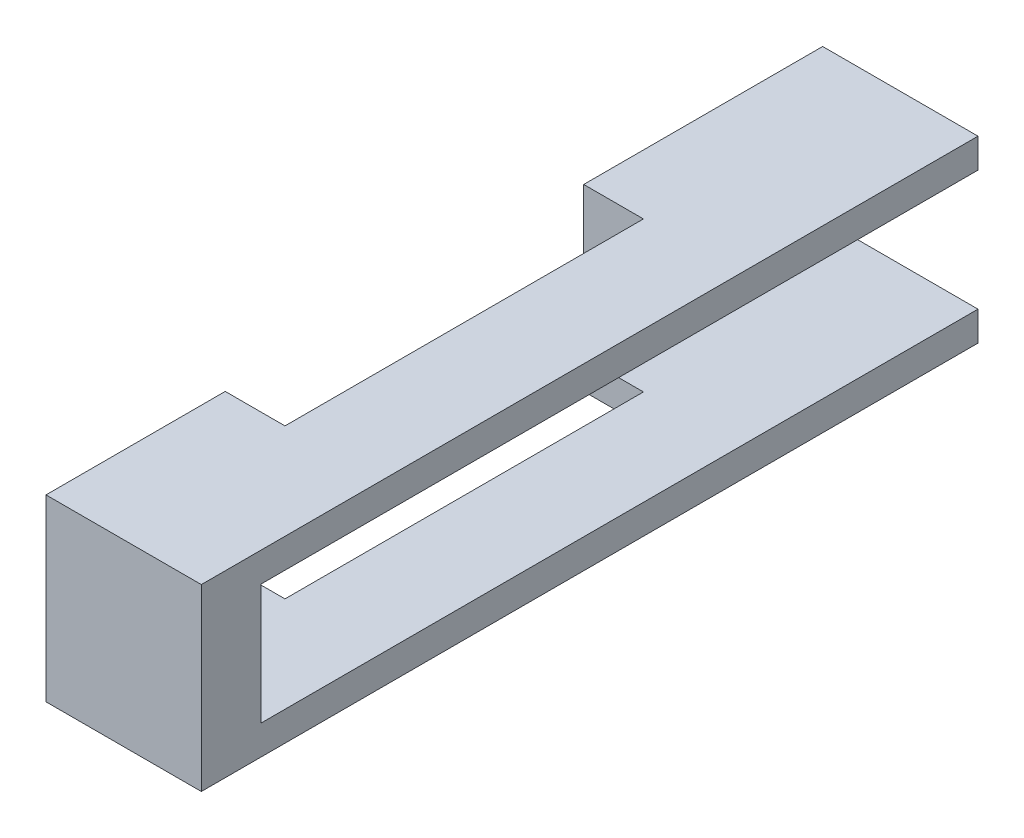
ISO-10303-21;
HEADER;
FILE_DESCRIPTION(('STEP AP214'),'2;1');
FILE_NAME('part.step','',(''),(''),'','','');
FILE_SCHEMA(('AUTOMOTIVE_DESIGN { 1 0 10303 214 1 1 1 1 }'));
ENDSEC;
DATA;
#1=APPLICATION_CONTEXT('core data for automotive mechanical design processes');
#2=APPLICATION_PROTOCOL_DEFINITION('international standard','automotive_design',2000,#1);
#3=PRODUCT_CONTEXT('',#1,'mechanical');
#4=PRODUCT('Part','Part','',(#3));
#5=PRODUCT_RELATED_PRODUCT_CATEGORY('part','',(#4));
#6=PRODUCT_DEFINITION_FORMATION('','',#4);
#7=PRODUCT_DEFINITION_CONTEXT('part definition',#1,'design');
#8=PRODUCT_DEFINITION('design','',#6,#7);
#9=PRODUCT_DEFINITION_SHAPE('','',#8);
#10=(LENGTH_UNIT() NAMED_UNIT(*) SI_UNIT(.MILLI.,.METRE.));
#11=(NAMED_UNIT(*) PLANE_ANGLE_UNIT() SI_UNIT($,.RADIAN.));
#12=(NAMED_UNIT(*) SI_UNIT($,.STERADIAN.) SOLID_ANGLE_UNIT());
#13=UNCERTAINTY_MEASURE_WITH_UNIT(LENGTH_MEASURE(1.E-05),#10,'distance_accuracy_value','');
#14=(GEOMETRIC_REPRESENTATION_CONTEXT(3) GLOBAL_UNCERTAINTY_ASSIGNED_CONTEXT((#13)) GLOBAL_UNIT_ASSIGNED_CONTEXT((#10,
#11,#12)) REPRESENTATION_CONTEXT('',''));
#15=CARTESIAN_POINT('',(0.,0.,0.));
#16=DIRECTION('',(0.,0.,1.));
#17=DIRECTION('',(1.,0.,0.));
#18=AXIS2_PLACEMENT_3D('',#15,#16,#17);
#19=CARTESIAN_POINT('',(0.,30.,0.));
#20=DIRECTION('',(0.,1.,0.));
#21=DIRECTION('',(0.,0.,1.));
#22=AXIS2_PLACEMENT_3D('',#19,#20,#21);
#23=PLANE('',#22);
#24=DIRECTION('',(0.,0.,1.));
#25=VECTOR('',#24,1.);
#26=CARTESIAN_POINT('',(16.,30.,-135.));
#27=LINE('',#26,#25);
#28=CARTESIAN_POINT('',(16.,30.,-115.));
#29=VERTEX_POINT('',#28);
#30=CARTESIAN_POINT('',(16.,30.,15.));
#31=VERTEX_POINT('',#30);
#32=EDGE_CURVE('E240',#29,#31,#27,.T.);
#33=ORIENTED_EDGE('',*,*,#32,.F.);
#34=DIRECTION('',(-1.,0.,0.));
#35=VECTOR('',#34,1.);
#36=CARTESIAN_POINT('',(0.,30.,-115.));
#37=LINE('',#36,#35);
#38=CARTESIAN_POINT('',(-10.,30.,-115.));
#39=VERTEX_POINT('',#38);
#40=EDGE_CURVE('E53',#29,#39,#37,.T.);
#41=ORIENTED_EDGE('',*,*,#40,.T.);
#42=DIRECTION('',(0.,0.,-1.));
#43=VECTOR('',#42,1.);
#44=CARTESIAN_POINT('',(-10.,30.,-75.));
#45=LINE('',#44,#43);
#46=CARTESIAN_POINT('',(-10.,30.,-75.));
#47=VERTEX_POINT('',#46);
#48=EDGE_CURVE('E165',#47,#39,#45,.T.);
#49=ORIENTED_EDGE('',*,*,#48,.F.);
#50=DIRECTION('',(-1.,0.,0.));
#51=VECTOR('',#50,1.);
#52=CARTESIAN_POINT('',(0.,30.,-75.));
#53=LINE('',#52,#51);
#54=CARTESIAN_POINT('',(0.,30.,-75.));
#55=VERTEX_POINT('',#54);
#56=EDGE_CURVE('E280',#55,#47,#53,.T.);
#57=ORIENTED_EDGE('',*,*,#56,.F.);
#58=DIRECTION('',(0.,0.,1.));
#59=VECTOR('',#58,1.);
#60=CARTESIAN_POINT('',(0.,30.,-135.));
#61=LINE('',#60,#59);
#62=CARTESIAN_POINT('',(0.,30.,-15.));
#63=VERTEX_POINT('',#62);
#64=EDGE_CURVE('E188',#55,#63,#61,.T.);
#65=ORIENTED_EDGE('',*,*,#64,.T.);
#66=DIRECTION('',(-1.,0.,0.));
#67=VECTOR('',#66,1.);
#68=CARTESIAN_POINT('',(-15.,30.,-15.));
#69=LINE('',#68,#67);
#70=CARTESIAN_POINT('',(-9.99999999999998,30.,-15.));
#71=VERTEX_POINT('',#70);
#72=EDGE_CURVE('E202',#63,#71,#69,.T.);
#73=ORIENTED_EDGE('',*,*,#72,.T.);
#74=DIRECTION('',(0.,0.,-1.));
#75=VECTOR('',#74,1.);
#76=CARTESIAN_POINT('',(-9.99999999999998,30.,0.));
#77=LINE('',#76,#75);
#78=CARTESIAN_POINT('',(-9.99999999999998,30.,15.));
#79=VERTEX_POINT('',#78);
#80=EDGE_CURVE('E196',#79,#71,#77,.T.);
#81=ORIENTED_EDGE('',*,*,#80,.F.);
#82=DIRECTION('',(1.,0.,0.));
#83=VECTOR('',#82,1.);
#84=CARTESIAN_POINT('',(-15.,30.,15.));
#85=LINE('',#84,#83);
#86=EDGE_CURVE('E204',#79,#31,#85,.T.);
#87=ORIENTED_EDGE('',*,*,#86,.T.);
#88=EDGE_LOOP('',(#33,#41,#49,#57,#65,#73,#81,#87));
#89=FACE_BOUND('',#88,.T.);
#90=ADVANCED_FACE('F38',(#89),#23,.T.);
#91=CARTESIAN_POINT('',(0.,0.,0.));
#92=DIRECTION('',(0.,1.,0.));
#93=DIRECTION('',(0.,0.,1.));
#94=AXIS2_PLACEMENT_3D('',#91,#92,#93);
#95=PLANE('',#94);
#96=DIRECTION('',(1.,0.,0.));
#97=VECTOR('',#96,1.);
#98=CARTESIAN_POINT('',(0.,0.,-115.));
#99=LINE('',#98,#97);
#100=CARTESIAN_POINT('',(-10.,0.,-115.));
#101=VERTEX_POINT('',#100);
#102=CARTESIAN_POINT('',(16.,0.,-115.));
#103=VERTEX_POINT('',#102);
#104=EDGE_CURVE('E149',#101,#103,#99,.T.);
#105=ORIENTED_EDGE('',*,*,#104,.T.);
#106=DIRECTION('',(0.,0.,-1.));
#107=VECTOR('',#106,1.);
#108=CARTESIAN_POINT('',(16.,0.,15.));
#109=LINE('',#108,#107);
#110=CARTESIAN_POINT('',(16.,0.,15.));
#111=VERTEX_POINT('',#110);
#112=EDGE_CURVE('E245',#111,#103,#109,.T.);
#113=ORIENTED_EDGE('',*,*,#112,.F.);
#114=DIRECTION('',(1.,0.,0.));
#115=VECTOR('',#114,1.);
#116=CARTESIAN_POINT('',(-15.,0.,15.));
#117=LINE('',#116,#115);
#118=CARTESIAN_POINT('',(-9.99999999999998,0.,15.));
#119=VERTEX_POINT('',#118);
#120=EDGE_CURVE('E205',#119,#111,#117,.T.);
#121=ORIENTED_EDGE('',*,*,#120,.F.);
#122=DIRECTION('',(0.,0.,1.));
#123=VECTOR('',#122,1.);
#124=CARTESIAN_POINT('',(-9.99999999999998,0.,0.));
#125=LINE('',#124,#123);
#126=CARTESIAN_POINT('',(-9.99999999999999,0.,-15.));
#127=VERTEX_POINT('',#126);
#128=EDGE_CURVE('E190',#127,#119,#125,.T.);
#129=ORIENTED_EDGE('',*,*,#128,.F.);
#130=DIRECTION('',(-1.,0.,0.));
#131=VECTOR('',#130,1.);
#132=CARTESIAN_POINT('',(-15.,0.,-15.));
#133=LINE('',#132,#131);
#134=CARTESIAN_POINT('',(0.,0.,-15.));
#135=VERTEX_POINT('',#134);
#136=EDGE_CURVE('E201',#135,#127,#133,.T.);
#137=ORIENTED_EDGE('',*,*,#136,.F.);
#138=DIRECTION('',(0.,0.,1.));
#139=VECTOR('',#138,1.);
#140=CARTESIAN_POINT('',(0.,0.,-135.));
#141=LINE('',#140,#139);
#142=CARTESIAN_POINT('',(0.,0.,-75.));
#143=VERTEX_POINT('',#142);
#144=EDGE_CURVE('E182',#143,#135,#141,.T.);
#145=ORIENTED_EDGE('',*,*,#144,.F.);
#146=DIRECTION('',(-1.,0.,0.));
#147=VECTOR('',#146,1.);
#148=CARTESIAN_POINT('',(0.,0.,-75.));
#149=LINE('',#148,#147);
#150=CARTESIAN_POINT('',(-10.,0.,-75.));
#151=VERTEX_POINT('',#150);
#152=EDGE_CURVE('E172',#143,#151,#149,.T.);
#153=ORIENTED_EDGE('',*,*,#152,.T.);
#154=DIRECTION('',(0.,0.,-1.));
#155=VECTOR('',#154,1.);
#156=CARTESIAN_POINT('',(-10.,0.,-75.));
#157=LINE('',#156,#155);
#158=EDGE_CURVE('E162',#151,#101,#157,.T.);
#159=ORIENTED_EDGE('',*,*,#158,.T.);
#160=EDGE_LOOP('',(#105,#113,#121,#129,#137,#145,#153,#159));
#161=FACE_BOUND('',#160,.T.);
#162=ADVANCED_FACE('F169',(#161),#95,.F.);
#163=CARTESIAN_POINT('',(-10.,0.,-75.));
#164=DIRECTION('',(-1.,0.,0.));
#165=DIRECTION('',(0.,0.,1.));
#166=AXIS2_PLACEMENT_3D('',#163,#164,#165);
#167=PLANE('',#166);
#168=CARTESIAN_POINT('',(-10.,14.9999999999996,-105.));
#169=DIRECTION('',(-1.,0.,0.));
#170=DIRECTION('',(0.,0.,1.));
#171=AXIS2_PLACEMENT_3D('',#168,#169,#170);
#172=CIRCLE('',#171,5.25);
#173=CARTESIAN_POINT('',(-10.,14.9999999999996,-99.75));
#174=VERTEX_POINT('',#173);
#175=EDGE_CURVE('E219',#174,#174,#172,.T.);
#176=ORIENTED_EDGE('',*,*,#175,.F.);
#177=EDGE_LOOP('',(#176));
#178=FACE_BOUND('',#177,.T.);
#179=CARTESIAN_POINT('',(-10.,15.,-85.));
#180=DIRECTION('',(-1.,0.,0.));
#181=DIRECTION('',(0.,0.,1.));
#182=AXIS2_PLACEMENT_3D('',#179,#180,#181);
#183=CIRCLE('',#182,5.25);
#184=CARTESIAN_POINT('',(-10.,15.,-79.75));
#185=VERTEX_POINT('',#184);
#186=EDGE_CURVE('E324',#185,#185,#183,.T.);
#187=ORIENTED_EDGE('',*,*,#186,.F.);
#188=EDGE_LOOP('',(#187));
#189=FACE_BOUND('',#188,.T.);
#190=ORIENTED_EDGE('',*,*,#48,.T.);
#191=DIRECTION('',(0.,-1.,0.));
#192=VECTOR('',#191,1.);
#193=CARTESIAN_POINT('',(-10.,87.,-115.));
#194=LINE('',#193,#192);
#195=EDGE_CURVE('E152',#39,#101,#194,.T.);
#196=ORIENTED_EDGE('',*,*,#195,.T.);
#197=ORIENTED_EDGE('',*,*,#158,.F.);
#198=DIRECTION('',(0.,1.,0.));
#199=VECTOR('',#198,1.);
#200=CARTESIAN_POINT('',(-10.,0.,-75.));
#201=LINE('',#200,#199);
#202=EDGE_CURVE('E278',#151,#47,#201,.T.);
#203=ORIENTED_EDGE('',*,*,#202,.T.);
#204=EDGE_LOOP('',(#190,#196,#197,#203));
#205=FACE_BOUND('',#204,.T.);
#206=ADVANCED_FACE('F160',(#178,#189,#205),#167,.T.);
#207=CARTESIAN_POINT('',(15.05,4.925,33.461069902588));
#208=DIRECTION('',(0.,-1.,0.));
#209=DIRECTION('',(0.,0.,-1.));
#210=AXIS2_PLACEMENT_3D('',#207,#208,#209);
#211=PLANE('',#210);
#212=DIRECTION('',(1.,0.,0.));
#213=VECTOR('',#212,1.);
#214=CARTESIAN_POINT('',(15.05,4.925,-115.));
#215=LINE('',#214,#213);
#216=CARTESIAN_POINT('',(-5.04999999999999,4.925,-115.));
#217=VERTEX_POINT('',#216);
#218=CARTESIAN_POINT('',(16.,4.925,-115.));
#219=VERTEX_POINT('',#218);
#220=EDGE_CURVE('E317',#217,#219,#215,.T.);
#221=ORIENTED_EDGE('',*,*,#220,.F.);
#222=DIRECTION('',(0.,0.,-1.));
#223=VECTOR('',#222,1.);
#224=CARTESIAN_POINT('',(-5.04999999999999,4.925,33.461069902588));
#225=LINE('',#224,#223);
#226=CARTESIAN_POINT('',(-5.04999999999999,4.925,-75.));
#227=VERTEX_POINT('',#226);
#228=EDGE_CURVE('E258',#227,#217,#225,.T.);
#229=ORIENTED_EDGE('',*,*,#228,.F.);
#230=DIRECTION('',(-1.,0.,0.));
#231=VECTOR('',#230,1.);
#232=CARTESIAN_POINT('',(0.,4.925,-75.));
#233=LINE('',#232,#231);
#234=CARTESIAN_POINT('',(0.,4.925,-75.));
#235=VERTEX_POINT('',#234);
#236=EDGE_CURVE('E212',#235,#227,#233,.T.);
#237=ORIENTED_EDGE('',*,*,#236,.F.);
#238=DIRECTION('',(0.,0.,1.));
#239=VECTOR('',#238,1.);
#240=CARTESIAN_POINT('',(0.,4.925,-135.));
#241=LINE('',#240,#239);
#242=CARTESIAN_POINT('',(0.,4.925,-15.));
#243=VERTEX_POINT('',#242);
#244=EDGE_CURVE('E272',#235,#243,#241,.T.);
#245=ORIENTED_EDGE('',*,*,#244,.T.);
#246=DIRECTION('',(1.,0.,0.));
#247=VECTOR('',#246,1.);
#248=CARTESIAN_POINT('',(-15.,4.925,-15.));
#249=LINE('',#248,#247);
#250=CARTESIAN_POINT('',(-5.04999999999999,4.925,-15.));
#251=VERTEX_POINT('',#250);
#252=EDGE_CURVE('E274',#251,#243,#249,.T.);
#253=ORIENTED_EDGE('',*,*,#252,.F.);
#254=CARTESIAN_POINT('',(-5.04999999999999,4.925,5.));
#255=VERTEX_POINT('',#254);
#256=EDGE_CURVE('E256',#255,#251,#225,.T.);
#257=ORIENTED_EDGE('',*,*,#256,.F.);
#258=DIRECTION('',(-1.,0.,0.));
#259=VECTOR('',#258,1.);
#260=CARTESIAN_POINT('',(15.05,4.925,5.));
#261=LINE('',#260,#259);
#262=CARTESIAN_POINT('',(16.,4.925,5.));
#263=VERTEX_POINT('',#262);
#264=EDGE_CURVE('E247',#263,#255,#261,.T.);
#265=ORIENTED_EDGE('',*,*,#264,.F.);
#266=DIRECTION('',(0.,0.,1.));
#267=VECTOR('',#266,1.);
#268=CARTESIAN_POINT('',(16.,4.925,-135.));
#269=LINE('',#268,#267);
#270=EDGE_CURVE('E223',#219,#263,#269,.T.);
#271=ORIENTED_EDGE('',*,*,#270,.F.);
#272=EDGE_LOOP('',(#221,#229,#237,#245,#253,#257,#265,#271));
#273=FACE_BOUND('',#272,.T.);
#274=ADVANCED_FACE('F366',(#273),#211,.F.);
#275=CARTESIAN_POINT('',(-5.04999999999999,25.075,33.461069902588));
#276=DIRECTION('',(0.,1.,0.));
#277=DIRECTION('',(0.,0.,1.));
#278=AXIS2_PLACEMENT_3D('',#275,#276,#277);
#279=PLANE('',#278);
#280=DIRECTION('',(-1.,0.,0.));
#281=VECTOR('',#280,1.);
#282=CARTESIAN_POINT('',(-5.04999999999999,25.075,-115.));
#283=LINE('',#282,#281);
#284=CARTESIAN_POINT('',(16.,25.075,-115.));
#285=VERTEX_POINT('',#284);
#286=CARTESIAN_POINT('',(-5.04999999999999,25.075,-115.));
#287=VERTEX_POINT('',#286);
#288=EDGE_CURVE('E312',#285,#287,#283,.T.);
#289=ORIENTED_EDGE('',*,*,#288,.F.);
#290=DIRECTION('',(0.,0.,-1.));
#291=VECTOR('',#290,1.);
#292=CARTESIAN_POINT('',(16.,25.075,5.));
#293=LINE('',#292,#291);
#294=CARTESIAN_POINT('',(16.,25.075,5.));
#295=VERTEX_POINT('',#294);
#296=EDGE_CURVE('E232',#295,#285,#293,.T.);
#297=ORIENTED_EDGE('',*,*,#296,.F.);
#298=DIRECTION('',(1.,0.,0.));
#299=VECTOR('',#298,1.);
#300=CARTESIAN_POINT('',(-5.05,25.075,5.));
#301=LINE('',#300,#299);
#302=CARTESIAN_POINT('',(-5.04999999999999,25.075,5.));
#303=VERTEX_POINT('',#302);
#304=EDGE_CURVE('E248',#303,#295,#301,.T.);
#305=ORIENTED_EDGE('',*,*,#304,.F.);
#306=DIRECTION('',(0.,0.,-1.));
#307=VECTOR('',#306,1.);
#308=CARTESIAN_POINT('',(-5.04999999999999,25.075,33.461069902588));
#309=LINE('',#308,#307);
#310=CARTESIAN_POINT('',(-5.04999999999999,25.075,-15.));
#311=VERTEX_POINT('',#310);
#312=EDGE_CURVE('E251',#303,#311,#309,.T.);
#313=ORIENTED_EDGE('',*,*,#312,.T.);
#314=DIRECTION('',(-1.,0.,0.));
#315=VECTOR('',#314,1.);
#316=CARTESIAN_POINT('',(-15.,25.075,-15.));
#317=LINE('',#316,#315);
#318=CARTESIAN_POINT('',(0.,25.075,-15.));
#319=VERTEX_POINT('',#318);
#320=EDGE_CURVE('E269',#319,#311,#317,.T.);
#321=ORIENTED_EDGE('',*,*,#320,.F.);
#322=DIRECTION('',(0.,0.,-1.));
#323=VECTOR('',#322,1.);
#324=CARTESIAN_POINT('',(0.,25.075,-135.));
#325=LINE('',#324,#323);
#326=CARTESIAN_POINT('',(0.,25.075,-75.));
#327=VERTEX_POINT('',#326);
#328=EDGE_CURVE('E61',#319,#327,#325,.T.);
#329=ORIENTED_EDGE('',*,*,#328,.T.);
#330=DIRECTION('',(1.,0.,0.));
#331=VECTOR('',#330,1.);
#332=CARTESIAN_POINT('',(0.,25.075,-75.));
#333=LINE('',#332,#331);
#334=CARTESIAN_POINT('',(-5.04999999999999,25.075,-75.));
#335=VERTEX_POINT('',#334);
#336=EDGE_CURVE('E208',#335,#327,#333,.T.);
#337=ORIENTED_EDGE('',*,*,#336,.F.);
#338=EDGE_CURVE('E255',#335,#287,#309,.T.);
#339=ORIENTED_EDGE('',*,*,#338,.T.);
#340=EDGE_LOOP('',(#289,#297,#305,#313,#321,#329,#337,#339));
#341=FACE_BOUND('',#340,.T.);
#342=ADVANCED_FACE('F315',(#341),#279,.F.);
#343=CARTESIAN_POINT('',(-5.04999999999999,4.925,33.461069902588));
#344=DIRECTION('',(-1.,0.,0.));
#345=DIRECTION('',(0.,0.,1.));
#346=AXIS2_PLACEMENT_3D('',#343,#344,#345);
#347=PLANE('',#346);
#348=CARTESIAN_POINT('',(-5.04999999999999,15.,-85.));
#349=DIRECTION('',(-1.,0.,0.));
#350=DIRECTION('',(0.,0.,1.));
#351=AXIS2_PLACEMENT_3D('',#348,#349,#350);
#352=CIRCLE('',#351,5.25);
#353=CARTESIAN_POINT('',(-5.04999999999999,15.,-79.75));
#354=VERTEX_POINT('',#353);
#355=EDGE_CURVE('E215',#354,#354,#352,.T.);
#356=ORIENTED_EDGE('',*,*,#355,.T.);
#357=EDGE_LOOP('',(#356));
#358=FACE_BOUND('',#357,.T.);
#359=CARTESIAN_POINT('',(-5.04999999999999,14.9999999999996,-105.));
#360=DIRECTION('',(-1.,0.,0.));
#361=DIRECTION('',(0.,0.,1.));
#362=AXIS2_PLACEMENT_3D('',#359,#360,#361);
#363=CIRCLE('',#362,5.25);
#364=CARTESIAN_POINT('',(-5.04999999999999,14.9999999999996,-99.75));
#365=VERTEX_POINT('',#364);
#366=EDGE_CURVE('E218',#365,#365,#363,.T.);
#367=ORIENTED_EDGE('',*,*,#366,.T.);
#368=EDGE_LOOP('',(#367));
#369=FACE_BOUND('',#368,.T.);
#370=DIRECTION('',(0.,-1.,0.));
#371=VECTOR('',#370,1.);
#372=CARTESIAN_POINT('',(-5.04999999999999,4.925,-115.));
#373=LINE('',#372,#371);
#374=EDGE_CURVE('E166',#287,#217,#373,.T.);
#375=ORIENTED_EDGE('',*,*,#374,.F.);
#376=ORIENTED_EDGE('',*,*,#338,.F.);
#377=DIRECTION('',(0.,1.,0.));
#378=VECTOR('',#377,1.);
#379=CARTESIAN_POINT('',(-5.04999999999999,0.,-75.));
#380=LINE('',#379,#378);
#381=EDGE_CURVE('E250',#227,#335,#380,.T.);
#382=ORIENTED_EDGE('',*,*,#381,.F.);
#383=ORIENTED_EDGE('',*,*,#228,.T.);
#384=EDGE_LOOP('',(#375,#376,#382,#383));
#385=FACE_BOUND('',#384,.T.);
#386=ADVANCED_FACE('F375',(#358,#369,#385),#347,.F.);
#387=CARTESIAN_POINT('',(16.,0.,0.));
#388=DIRECTION('',(1.,0.,0.));
#389=DIRECTION('',(0.,0.,-1.));
#390=AXIS2_PLACEMENT_3D('',#387,#388,#389);
#391=PLANE('',#390);
#392=ORIENTED_EDGE('',*,*,#112,.T.);
#393=DIRECTION('',(0.,1.,0.));
#394=VECTOR('',#393,1.);
#395=CARTESIAN_POINT('',(16.,0.,-115.));
#396=LINE('',#395,#394);
#397=EDGE_CURVE('E11',#103,#219,#396,.T.);
#398=ORIENTED_EDGE('',*,*,#397,.T.);
#399=ORIENTED_EDGE('',*,*,#270,.T.);
#400=DIRECTION('',(0.,1.,0.));
#401=VECTOR('',#400,1.);
#402=CARTESIAN_POINT('',(16.,4.925,5.));
#403=LINE('',#402,#401);
#404=EDGE_CURVE('E226',#263,#295,#403,.T.);
#405=ORIENTED_EDGE('',*,*,#404,.T.);
#406=ORIENTED_EDGE('',*,*,#296,.T.);
#407=EDGE_CURVE('E42',#285,#29,#396,.T.);
#408=ORIENTED_EDGE('',*,*,#407,.T.);
#409=ORIENTED_EDGE('',*,*,#32,.T.);
#410=DIRECTION('',(0.,-1.,0.));
#411=VECTOR('',#410,1.);
#412=CARTESIAN_POINT('',(16.,30.,15.));
#413=LINE('',#412,#411);
#414=EDGE_CURVE('E242',#31,#111,#413,.T.);
#415=ORIENTED_EDGE('',*,*,#414,.T.);
#416=EDGE_LOOP('',(#392,#398,#399,#405,#406,#408,#409,#415));
#417=FACE_BOUND('',#416,.T.);
#418=ADVANCED_FACE('F309',(#417),#391,.T.);
#419=CARTESIAN_POINT('',(0.,0.,-135.));
#420=DIRECTION('',(-1.,0.,0.));
#421=DIRECTION('',(0.,-1.,0.));
#422=AXIS2_PLACEMENT_3D('',#419,#420,#421);
#423=PLANE('',#422);
#424=ORIENTED_EDGE('',*,*,#328,.F.);
#425=DIRECTION('',(0.,-1.,0.));
#426=VECTOR('',#425,1.);
#427=CARTESIAN_POINT('',(0.,0.,-15.));
#428=LINE('',#427,#426);
#429=EDGE_CURVE('E185',#63,#319,#428,.T.);
#430=ORIENTED_EDGE('',*,*,#429,.F.);
#431=ORIENTED_EDGE('',*,*,#64,.F.);
#432=DIRECTION('',(0.,1.,0.));
#433=VECTOR('',#432,1.);
#434=CARTESIAN_POINT('',(0.,0.,-75.));
#435=LINE('',#434,#433);
#436=EDGE_CURVE('E178',#327,#55,#435,.T.);
#437=ORIENTED_EDGE('',*,*,#436,.F.);
#438=EDGE_LOOP('',(#424,#430,#431,#437));
#439=FACE_BOUND('',#438,.T.);
#440=ADVANCED_FACE('F289',(#439),#423,.T.);
#441=CARTESIAN_POINT('',(0.,0.,-135.));
#442=DIRECTION('',(-1.,0.,0.));
#443=DIRECTION('',(0.,-1.,0.));
#444=AXIS2_PLACEMENT_3D('',#441,#442,#443);
#445=PLANE('',#444);
#446=ORIENTED_EDGE('',*,*,#244,.F.);
#447=DIRECTION('',(0.,1.,0.));
#448=VECTOR('',#447,1.);
#449=CARTESIAN_POINT('',(0.,0.,-75.));
#450=LINE('',#449,#448);
#451=EDGE_CURVE('E173',#143,#235,#450,.T.);
#452=ORIENTED_EDGE('',*,*,#451,.F.);
#453=ORIENTED_EDGE('',*,*,#144,.T.);
#454=DIRECTION('',(0.,-1.,0.));
#455=VECTOR('',#454,1.);
#456=CARTESIAN_POINT('',(0.,0.,-15.));
#457=LINE('',#456,#455);
#458=EDGE_CURVE('E175',#243,#135,#457,.T.);
#459=ORIENTED_EDGE('',*,*,#458,.F.);
#460=EDGE_LOOP('',(#446,#452,#453,#459));
#461=FACE_BOUND('',#460,.T.);
#462=ADVANCED_FACE('F295',(#461),#445,.T.);
#463=CARTESIAN_POINT('',(-15.,30.,-15.));
#464=DIRECTION('',(0.,0.,1.));
#465=DIRECTION('',(1.,0.,0.));
#466=AXIS2_PLACEMENT_3D('',#463,#464,#465);
#467=PLANE('',#466);
#468=DIRECTION('',(0.,-1.,0.));
#469=VECTOR('',#468,1.);
#470=CARTESIAN_POINT('',(-5.04999999999999,30.,-15.));
#471=LINE('',#470,#469);
#472=EDGE_CURVE('E265',#311,#251,#471,.T.);
#473=ORIENTED_EDGE('',*,*,#472,.T.);
#474=ORIENTED_EDGE('',*,*,#252,.T.);
#475=ORIENTED_EDGE('',*,*,#458,.T.);
#476=ORIENTED_EDGE('',*,*,#136,.T.);
#477=DIRECTION('',(0.,-1.,0.));
#478=VECTOR('',#477,1.);
#479=CARTESIAN_POINT('',(-9.99999999999998,55.,-15.));
#480=LINE('',#479,#478);
#481=EDGE_CURVE('E192',#71,#127,#480,.T.);
#482=ORIENTED_EDGE('',*,*,#481,.F.);
#483=ORIENTED_EDGE('',*,*,#72,.F.);
#484=ORIENTED_EDGE('',*,*,#429,.T.);
#485=ORIENTED_EDGE('',*,*,#320,.T.);
#486=EDGE_LOOP('',(#473,#474,#475,#476,#482,#483,#484,#485));
#487=FACE_BOUND('',#486,.T.);
#488=ADVANCED_FACE('F40',(#487),#467,.F.);
#489=CARTESIAN_POINT('',(-15.,30.,15.));
#490=DIRECTION('',(0.,0.,-1.));
#491=DIRECTION('',(-1.,0.,0.));
#492=AXIS2_PLACEMENT_3D('',#489,#490,#491);
#493=PLANE('',#492);
#494=ORIENTED_EDGE('',*,*,#86,.F.);
#495=DIRECTION('',(0.,-1.,0.));
#496=VECTOR('',#495,1.);
#497=CARTESIAN_POINT('',(-9.99999999999998,55.,15.));
#498=LINE('',#497,#496);
#499=EDGE_CURVE('E193',#79,#119,#498,.T.);
#500=ORIENTED_EDGE('',*,*,#499,.T.);
#501=ORIENTED_EDGE('',*,*,#120,.T.);
#502=ORIENTED_EDGE('',*,*,#414,.F.);
#503=EDGE_LOOP('',(#494,#500,#501,#502));
#504=FACE_BOUND('',#503,.T.);
#505=ADVANCED_FACE('F308',(#504),#493,.F.);
#506=CARTESIAN_POINT('',(-4.99999999999999,4.975,5.));
#507=DIRECTION('',(0.,0.,1.));
#508=DIRECTION('',(1.,0.,0.));
#509=AXIS2_PLACEMENT_3D('',#506,#507,#508);
#510=PLANE('',#509);
#511=ORIENTED_EDGE('',*,*,#304,.T.);
#512=ORIENTED_EDGE('',*,*,#404,.F.);
#513=ORIENTED_EDGE('',*,*,#264,.T.);
#514=DIRECTION('',(0.,1.,0.));
#515=VECTOR('',#514,1.);
#516=CARTESIAN_POINT('',(-5.04999999999999,4.925,5.));
#517=LINE('',#516,#515);
#518=EDGE_CURVE('E252',#255,#303,#517,.T.);
#519=ORIENTED_EDGE('',*,*,#518,.T.);
#520=EDGE_LOOP('',(#511,#512,#513,#519));
#521=FACE_BOUND('',#520,.T.);
#522=ADVANCED_FACE('F335',(#521),#510,.F.);
#523=CARTESIAN_POINT('',(-9.99999999999998,55.,0.));
#524=DIRECTION('',(1.,0.,0.));
#525=DIRECTION('',(0.,0.,-1.));
#526=AXIS2_PLACEMENT_3D('',#523,#524,#525);
#527=PLANE('',#526);
#528=CARTESIAN_POINT('',(-10.,15.,-5.));
#529=DIRECTION('',(-1.,0.,0.));
#530=DIRECTION('',(0.,0.,1.));
#531=AXIS2_PLACEMENT_3D('',#528,#529,#530);
#532=CIRCLE('',#531,5.25);
#533=CARTESIAN_POINT('',(-10.,15.,0.249999999999996));
#534=VERTEX_POINT('',#533);
#535=EDGE_CURVE('E235',#534,#534,#532,.T.);
#536=ORIENTED_EDGE('',*,*,#535,.F.);
#537=EDGE_LOOP('',(#536));
#538=FACE_BOUND('',#537,.T.);
#539=ORIENTED_EDGE('',*,*,#80,.T.);
#540=ORIENTED_EDGE('',*,*,#481,.T.);
#541=ORIENTED_EDGE('',*,*,#128,.T.);
#542=ORIENTED_EDGE('',*,*,#499,.F.);
#543=EDGE_LOOP('',(#539,#540,#541,#542));
#544=FACE_BOUND('',#543,.T.);
#545=ADVANCED_FACE('F303',(#538,#544),#527,.F.);
#546=CARTESIAN_POINT('',(0.,0.,-75.));
#547=DIRECTION('',(0.,0.,-1.));
#548=DIRECTION('',(-1.,0.,0.));
#549=AXIS2_PLACEMENT_3D('',#546,#547,#548);
#550=PLANE('',#549);
#551=ORIENTED_EDGE('',*,*,#451,.T.);
#552=ORIENTED_EDGE('',*,*,#236,.T.);
#553=ORIENTED_EDGE('',*,*,#381,.T.);
#554=ORIENTED_EDGE('',*,*,#336,.T.);
#555=ORIENTED_EDGE('',*,*,#436,.T.);
#556=ORIENTED_EDGE('',*,*,#56,.T.);
#557=ORIENTED_EDGE('',*,*,#202,.F.);
#558=ORIENTED_EDGE('',*,*,#152,.F.);
#559=EDGE_LOOP('',(#551,#552,#553,#554,#555,#556,#557,#558));
#560=FACE_BOUND('',#559,.T.);
#561=ADVANCED_FACE('F285',(#560),#550,.F.);
#562=CARTESIAN_POINT('',(-5.04999999999999,15.,-5.));
#563=DIRECTION('',(-1.,0.,0.));
#564=DIRECTION('',(0.,0.,1.));
#565=AXIS2_PLACEMENT_3D('',#562,#563,#564);
#566=CIRCLE('',#565,5.25);
#567=CARTESIAN_POINT('',(-5.04999999999999,15.,0.249999999999996));
#568=VERTEX_POINT('',#567);
#569=EDGE_CURVE('E221',#568,#568,#566,.T.);
#570=ORIENTED_EDGE('',*,*,#569,.T.);
#571=EDGE_LOOP('',(#570));
#572=FACE_BOUND('',#571,.T.);
#573=ORIENTED_EDGE('',*,*,#312,.F.);
#574=ORIENTED_EDGE('',*,*,#518,.F.);
#575=ORIENTED_EDGE('',*,*,#256,.T.);
#576=ORIENTED_EDGE('',*,*,#472,.F.);
#577=EDGE_LOOP('',(#573,#574,#575,#576));
#578=FACE_BOUND('',#577,.T.);
#579=ADVANCED_FACE('F341',(#572,#578),#347,.F.);
#580=CARTESIAN_POINT('',(0.,15.,-85.));
#581=DIRECTION('',(-1.,0.,0.));
#582=DIRECTION('',(0.,0.,1.));
#583=AXIS2_PLACEMENT_3D('',#580,#581,#582);
#584=CYLINDRICAL_SURFACE('',#583,5.25);
#585=ORIENTED_EDGE('',*,*,#186,.T.);
#586=EDGE_LOOP('',(#585));
#587=FACE_BOUND('',#586,.T.);
#588=ORIENTED_EDGE('',*,*,#355,.F.);
#589=EDGE_LOOP('',(#588));
#590=FACE_BOUND('',#589,.T.);
#591=ADVANCED_FACE('F374',(#587,#590),#584,.F.);
#592=CARTESIAN_POINT('',(0.,14.9999999999996,-105.));
#593=DIRECTION('',(-1.,0.,0.));
#594=DIRECTION('',(0.,0.,1.));
#595=AXIS2_PLACEMENT_3D('',#592,#593,#594);
#596=CYLINDRICAL_SURFACE('',#595,5.25);
#597=ORIENTED_EDGE('',*,*,#175,.T.);
#598=EDGE_LOOP('',(#597));
#599=FACE_BOUND('',#598,.T.);
#600=ORIENTED_EDGE('',*,*,#366,.F.);
#601=EDGE_LOOP('',(#600));
#602=FACE_BOUND('',#601,.T.);
#603=ADVANCED_FACE('F382',(#599,#602),#596,.F.);
#604=CARTESIAN_POINT('',(0.,15.,-5.));
#605=DIRECTION('',(-1.,0.,0.));
#606=DIRECTION('',(0.,0.,1.));
#607=AXIS2_PLACEMENT_3D('',#604,#605,#606);
#608=CYLINDRICAL_SURFACE('',#607,5.25);
#609=ORIENTED_EDGE('',*,*,#535,.T.);
#610=EDGE_LOOP('',(#609));
#611=FACE_BOUND('',#610,.T.);
#612=ORIENTED_EDGE('',*,*,#569,.F.);
#613=EDGE_LOOP('',(#612));
#614=FACE_BOUND('',#613,.T.);
#615=ADVANCED_FACE('F331',(#611,#614),#608,.F.);
#616=CARTESIAN_POINT('',(0.,87.,-115.));
#617=DIRECTION('',(0.,0.,-1.));
#618=DIRECTION('',(-1.,0.,0.));
#619=AXIS2_PLACEMENT_3D('',#616,#617,#618);
#620=PLANE('',#619);
#621=ORIENTED_EDGE('',*,*,#407,.F.);
#622=ORIENTED_EDGE('',*,*,#288,.T.);
#623=ORIENTED_EDGE('',*,*,#374,.T.);
#624=ORIENTED_EDGE('',*,*,#220,.T.);
#625=ORIENTED_EDGE('',*,*,#397,.F.);
#626=ORIENTED_EDGE('',*,*,#104,.F.);
#627=ORIENTED_EDGE('',*,*,#195,.F.);
#628=ORIENTED_EDGE('',*,*,#40,.F.);
#629=EDGE_LOOP('',(#621,#622,#623,#624,#625,#626,#627,#628));
#630=FACE_BOUND('',#629,.T.);
#631=ADVANCED_FACE('F151',(#630),#620,.T.);
#632=CLOSED_SHELL('',(#90,#162,#206,#274,#342,#386,#418,#440,#462,#488,#505,#522,#545,#561,#579,
#591,#603,#615,#631));
#633=MANIFOLD_SOLID_BREP('B2',#632);
#634=ADVANCED_BREP_SHAPE_REPRESENTATION('',(#18,#633),#14);
#635=SHAPE_DEFINITION_REPRESENTATION(#9,#634);
ENDSEC;
END-ISO-10303-21;
